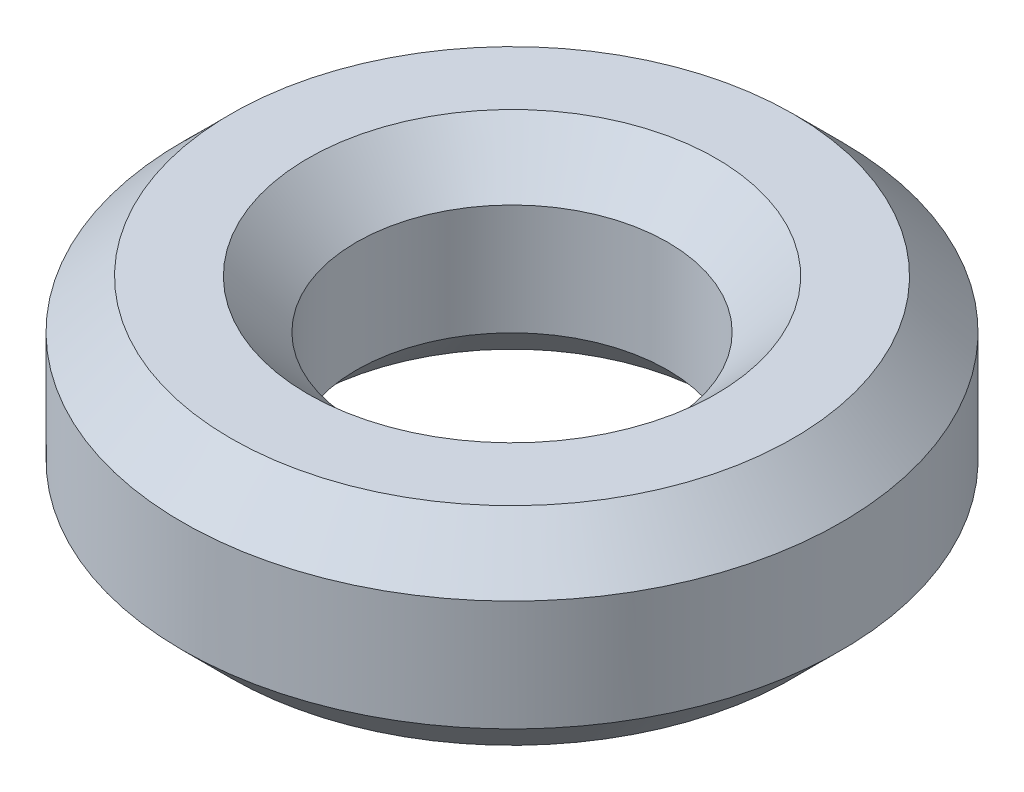
ISO-10303-21;
HEADER;
FILE_DESCRIPTION(('STEP AP214'),'2;1');
FILE_NAME('part.step','',(''),(''),'','','');
FILE_SCHEMA(('AUTOMOTIVE_DESIGN { 1 0 10303 214 1 1 1 1 }'));
ENDSEC;
DATA;
#1=APPLICATION_CONTEXT('core data for automotive mechanical design processes');
#2=APPLICATION_PROTOCOL_DEFINITION('international standard','automotive_design',2000,#1);
#3=PRODUCT_CONTEXT('',#1,'mechanical');
#4=PRODUCT('Part','Part','',(#3));
#5=PRODUCT_RELATED_PRODUCT_CATEGORY('part','',(#4));
#6=PRODUCT_DEFINITION_FORMATION('','',#4);
#7=PRODUCT_DEFINITION_CONTEXT('part definition',#1,'design');
#8=PRODUCT_DEFINITION('design','',#6,#7);
#9=PRODUCT_DEFINITION_SHAPE('','',#8);
#10=(LENGTH_UNIT() NAMED_UNIT(*) SI_UNIT(.MILLI.,.METRE.));
#11=(NAMED_UNIT(*) PLANE_ANGLE_UNIT() SI_UNIT($,.RADIAN.));
#12=(NAMED_UNIT(*) SI_UNIT($,.STERADIAN.) SOLID_ANGLE_UNIT());
#13=UNCERTAINTY_MEASURE_WITH_UNIT(LENGTH_MEASURE(1.E-05),#10,'distance_accuracy_value','');
#14=(GEOMETRIC_REPRESENTATION_CONTEXT(3) GLOBAL_UNCERTAINTY_ASSIGNED_CONTEXT((#13)) GLOBAL_UNIT_ASSIGNED_CONTEXT((#10,
#11,#12)) REPRESENTATION_CONTEXT('',''));
#15=CARTESIAN_POINT('',(0.,0.,0.));
#16=DIRECTION('',(0.,0.,1.));
#17=DIRECTION('',(1.,0.,0.));
#18=AXIS2_PLACEMENT_3D('',#15,#16,#17);
#19=CARTESIAN_POINT('',(0.,3.,0.));
#20=DIRECTION('',(0.,1.,0.));
#21=DIRECTION('',(0.,0.,1.));
#22=AXIS2_PLACEMENT_3D('',#19,#20,#21);
#23=PLANE('',#22);
#24=CARTESIAN_POINT('',(0.,3.,0.));
#25=DIRECTION('',(0.,1.,0.));
#26=DIRECTION('',(0.,0.,1.));
#27=AXIS2_PLACEMENT_3D('',#24,#25,#26);
#28=CIRCLE('',#27,2.95);
#29=CARTESIAN_POINT('',(0.,3.,2.95));
#30=VERTEX_POINT('',#29);
#31=EDGE_CURVE('E10',#30,#30,#28,.F.);
#32=ORIENTED_EDGE('',*,*,#31,.T.);
#33=EDGE_LOOP('',(#32));
#34=FACE_BOUND('',#33,.T.);
#35=CARTESIAN_POINT('',(0.,3.,0.));
#36=DIRECTION('',(0.,1.,0.));
#37=DIRECTION('',(0.,0.,1.));
#38=AXIS2_PLACEMENT_3D('',#35,#36,#37);
#39=CIRCLE('',#38,4.0625);
#40=CARTESIAN_POINT('',(0.,3.,-4.0625));
#41=VERTEX_POINT('',#40);
#42=EDGE_CURVE('E41',#41,#41,#39,.T.);
#43=ORIENTED_EDGE('',*,*,#42,.T.);
#44=EDGE_LOOP('',(#43));
#45=FACE_BOUND('',#44,.T.);
#46=ADVANCED_FACE('F33',(#34,#45),#23,.T.);
#47=CARTESIAN_POINT('',(0.,0.,0.));
#48=DIRECTION('',(0.,1.,0.));
#49=DIRECTION('',(0.,0.,1.));
#50=AXIS2_PLACEMENT_3D('',#47,#48,#49);
#51=PLANE('',#50);
#52=CARTESIAN_POINT('',(0.,0.,0.));
#53=DIRECTION('',(0.,1.,0.));
#54=DIRECTION('',(0.,0.,1.));
#55=AXIS2_PLACEMENT_3D('',#52,#53,#54);
#56=CIRCLE('',#55,2.95);
#57=CARTESIAN_POINT('',(0.,0.,2.95));
#58=VERTEX_POINT('',#57);
#59=EDGE_CURVE('E60',#58,#58,#56,.T.);
#60=ORIENTED_EDGE('',*,*,#59,.T.);
#61=EDGE_LOOP('',(#60));
#62=FACE_BOUND('',#61,.T.);
#63=CARTESIAN_POINT('',(0.,0.,0.));
#64=DIRECTION('',(0.,1.,0.));
#65=DIRECTION('',(0.,0.,1.));
#66=AXIS2_PLACEMENT_3D('',#63,#64,#65);
#67=CIRCLE('',#66,4.06249999999999);
#68=CARTESIAN_POINT('',(0.,0.,4.06249999999999));
#69=VERTEX_POINT('',#68);
#70=EDGE_CURVE('E63',#69,#69,#67,.F.);
#71=ORIENTED_EDGE('',*,*,#70,.T.);
#72=EDGE_LOOP('',(#71));
#73=FACE_BOUND('',#72,.T.);
#74=ADVANCED_FACE('F67',(#62,#73),#51,.F.);
#75=CARTESIAN_POINT('',(0.,3.,0.));
#76=DIRECTION('',(0.,-1.,0.));
#77=DIRECTION('',(0.,0.,-1.));
#78=AXIS2_PLACEMENT_3D('',#75,#76,#77);
#79=CYLINDRICAL_SURFACE('',#78,4.7625);
#80=CARTESIAN_POINT('',(0.,0.700000000000002,0.));
#81=DIRECTION('',(0.,1.,0.));
#82=DIRECTION('',(0.,0.,1.));
#83=AXIS2_PLACEMENT_3D('',#80,#81,#82);
#84=CIRCLE('',#83,4.7625);
#85=CARTESIAN_POINT('',(0.,0.700000000000002,4.7625));
#86=VERTEX_POINT('',#85);
#87=EDGE_CURVE('E45',#86,#86,#84,.T.);
#88=ORIENTED_EDGE('',*,*,#87,.T.);
#89=EDGE_LOOP('',(#88));
#90=FACE_BOUND('',#89,.T.);
#91=CARTESIAN_POINT('',(0.,2.3,0.));
#92=DIRECTION('',(0.,1.,0.));
#93=DIRECTION('',(0.,0.,1.));
#94=AXIS2_PLACEMENT_3D('',#91,#92,#93);
#95=CIRCLE('',#94,4.7625);
#96=CARTESIAN_POINT('',(0.,2.3,-4.7625));
#97=VERTEX_POINT('',#96);
#98=EDGE_CURVE('E49',#97,#97,#95,.F.);
#99=ORIENTED_EDGE('',*,*,#98,.T.);
#100=EDGE_LOOP('',(#99));
#101=FACE_BOUND('',#100,.T.);
#102=ADVANCED_FACE('F77',(#90,#101),#79,.T.);
#103=CARTESIAN_POINT('',(0.,3.,0.));
#104=DIRECTION('',(0.,-1.,0.));
#105=DIRECTION('',(0.,0.,-1.));
#106=AXIS2_PLACEMENT_3D('',#103,#104,#105);
#107=CYLINDRICAL_SURFACE('',#106,2.25);
#108=CARTESIAN_POINT('',(0.,0.700000000000003,0.));
#109=DIRECTION('',(0.,1.,0.));
#110=DIRECTION('',(0.,0.,1.));
#111=AXIS2_PLACEMENT_3D('',#108,#109,#110);
#112=CIRCLE('',#111,2.25);
#113=CARTESIAN_POINT('',(0.,0.700000000000003,2.25));
#114=VERTEX_POINT('',#113);
#115=EDGE_CURVE('E54',#114,#114,#112,.F.);
#116=ORIENTED_EDGE('',*,*,#115,.T.);
#117=EDGE_LOOP('',(#116));
#118=FACE_BOUND('',#117,.T.);
#119=CARTESIAN_POINT('',(0.,2.3,0.));
#120=DIRECTION('',(0.,1.,0.));
#121=DIRECTION('',(0.,0.,1.));
#122=AXIS2_PLACEMENT_3D('',#119,#120,#121);
#123=CIRCLE('',#122,2.25);
#124=CARTESIAN_POINT('',(0.,2.3,2.25));
#125=VERTEX_POINT('',#124);
#126=EDGE_CURVE('E57',#125,#125,#123,.T.);
#127=ORIENTED_EDGE('',*,*,#126,.T.);
#128=EDGE_LOOP('',(#127));
#129=FACE_BOUND('',#128,.T.);
#130=ADVANCED_FACE('F80',(#118,#129),#107,.F.);
#131=CARTESIAN_POINT('',(0.,0.,0.));
#132=DIRECTION('',(0.,-1.,0.));
#133=DIRECTION('',(0.,0.,-1.));
#134=AXIS2_PLACEMENT_3D('',#131,#132,#133);
#135=CONICAL_SURFACE('',#134,2.95,0.785398163397447);
#136=ORIENTED_EDGE('',*,*,#115,.F.);
#137=EDGE_LOOP('',(#136));
#138=FACE_BOUND('',#137,.T.);
#139=ORIENTED_EDGE('',*,*,#59,.F.);
#140=EDGE_LOOP('',(#139));
#141=FACE_BOUND('',#140,.T.);
#142=ADVANCED_FACE('F73',(#138,#141),#135,.F.);
#143=CARTESIAN_POINT('',(0.,0.700000000000002,0.));
#144=DIRECTION('',(0.,1.,0.));
#145=DIRECTION('',(0.,0.,1.));
#146=AXIS2_PLACEMENT_3D('',#143,#144,#145);
#147=CONICAL_SURFACE('',#146,4.7625,0.785398163397451);
#148=ORIENTED_EDGE('',*,*,#70,.F.);
#149=EDGE_LOOP('',(#148));
#150=FACE_BOUND('',#149,.T.);
#151=ORIENTED_EDGE('',*,*,#87,.F.);
#152=EDGE_LOOP('',(#151));
#153=FACE_BOUND('',#152,.T.);
#154=ADVANCED_FACE('F69',(#150,#153),#147,.T.);
#155=CARTESIAN_POINT('',(0.,2.3,0.));
#156=DIRECTION('',(0.,1.,0.));
#157=DIRECTION('',(0.,0.,1.));
#158=AXIS2_PLACEMENT_3D('',#155,#156,#157);
#159=CONICAL_SURFACE('',#158,2.25,0.78539816339745);
#160=ORIENTED_EDGE('',*,*,#31,.F.);
#161=EDGE_LOOP('',(#160));
#162=FACE_BOUND('',#161,.T.);
#163=ORIENTED_EDGE('',*,*,#126,.F.);
#164=EDGE_LOOP('',(#163));
#165=FACE_BOUND('',#164,.T.);
#166=ADVANCED_FACE('F72',(#162,#165),#159,.F.);
#167=CARTESIAN_POINT('',(0.,3.,0.));
#168=DIRECTION('',(0.,-1.,0.));
#169=DIRECTION('',(0.,0.,-1.));
#170=AXIS2_PLACEMENT_3D('',#167,#168,#169);
#171=CONICAL_SURFACE('',#170,4.0625,0.785398163397448);
#172=CARTESIAN_POINT('',(0.,2.3,-4.7625));
#173=CARTESIAN_POINT('',(0.,2.30729166666667,-4.75520833333333));
#174=CARTESIAN_POINT('',(0.,2.31458333333333,-4.74791666666667));
#175=CARTESIAN_POINT('',(0.,2.32916666666667,-4.73333333333333));
#176=CARTESIAN_POINT('',(0.,2.33645833333333,-4.72604166666667));
#177=CARTESIAN_POINT('',(0.,2.35104166666667,-4.71145833333333));
#178=CARTESIAN_POINT('',(0.,2.35833333333333,-4.70416666666667));
#179=CARTESIAN_POINT('',(0.,2.37291666666667,-4.68958333333333));
#180=CARTESIAN_POINT('',(0.,2.38020833333333,-4.68229166666667));
#181=CARTESIAN_POINT('',(0.,2.39479166666667,-4.66770833333333));
#182=CARTESIAN_POINT('',(0.,2.40208333333333,-4.66041666666667));
#183=CARTESIAN_POINT('',(0.,2.41666666666667,-4.64583333333333));
#184=CARTESIAN_POINT('',(0.,2.42395833333333,-4.63854166666667));
#185=CARTESIAN_POINT('',(0.,2.43854166666667,-4.62395833333333));
#186=CARTESIAN_POINT('',(0.,2.44583333333333,-4.61666666666667));
#187=CARTESIAN_POINT('',(0.,2.46041666666667,-4.60208333333333));
#188=CARTESIAN_POINT('',(0.,2.46770833333333,-4.59479166666667));
#189=CARTESIAN_POINT('',(0.,2.48229166666667,-4.58020833333333));
#190=CARTESIAN_POINT('',(0.,2.48958333333333,-4.57291666666667));
#191=CARTESIAN_POINT('',(0.,2.50416666666667,-4.55833333333333));
#192=CARTESIAN_POINT('',(0.,2.51145833333333,-4.55104166666667));
#193=CARTESIAN_POINT('',(0.,2.52604166666667,-4.53645833333333));
#194=CARTESIAN_POINT('',(0.,2.53333333333333,-4.52916666666667));
#195=CARTESIAN_POINT('',(0.,2.54791666666667,-4.51458333333334));
#196=CARTESIAN_POINT('',(0.,2.55520833333333,-4.50729166666667));
#197=CARTESIAN_POINT('',(0.,2.56979166666667,-4.49270833333333));
#198=CARTESIAN_POINT('',(0.,2.57708333333333,-4.48541666666667));
#199=CARTESIAN_POINT('',(0.,2.59166666666667,-4.47083333333333));
#200=CARTESIAN_POINT('',(0.,2.59895833333333,-4.46354166666667));
#201=CARTESIAN_POINT('',(0.,2.61354166666667,-4.44895833333333));
#202=CARTESIAN_POINT('',(0.,2.62083333333333,-4.44166666666667));
#203=CARTESIAN_POINT('',(0.,2.63541666666667,-4.42708333333333));
#204=CARTESIAN_POINT('',(0.,2.64270833333333,-4.41979166666667));
#205=CARTESIAN_POINT('',(0.,2.65729166666667,-4.40520833333334));
#206=CARTESIAN_POINT('',(0.,2.66458333333333,-4.39791666666667));
#207=CARTESIAN_POINT('',(0.,2.67916666666667,-4.38333333333333));
#208=CARTESIAN_POINT('',(0.,2.68645833333333,-4.37604166666667));
#209=CARTESIAN_POINT('',(0.,2.70104166666667,-4.36145833333333));
#210=CARTESIAN_POINT('',(0.,2.70833333333333,-4.35416666666667));
#211=CARTESIAN_POINT('',(0.,2.72291666666667,-4.33958333333334));
#212=CARTESIAN_POINT('',(0.,2.73020833333333,-4.33229166666667));
#213=CARTESIAN_POINT('',(0.,2.74479166666667,-4.31770833333333));
#214=CARTESIAN_POINT('',(0.,2.75208333333333,-4.31041666666667));
#215=CARTESIAN_POINT('',(0.,2.76666666666667,-4.29583333333333));
#216=CARTESIAN_POINT('',(0.,2.77395833333333,-4.28854166666667));
#217=CARTESIAN_POINT('',(0.,2.78854166666667,-4.27395833333334));
#218=CARTESIAN_POINT('',(0.,2.79583333333333,-4.26666666666667));
#219=CARTESIAN_POINT('',(0.,2.81041666666667,-4.25208333333333));
#220=CARTESIAN_POINT('',(0.,2.81770833333333,-4.24479166666667));
#221=CARTESIAN_POINT('',(0.,2.83229166666667,-4.23020833333334));
#222=CARTESIAN_POINT('',(0.,2.83958333333333,-4.22291666666667));
#223=CARTESIAN_POINT('',(0.,2.85416666666667,-4.20833333333333));
#224=CARTESIAN_POINT('',(0.,2.86145833333333,-4.20104166666667));
#225=CARTESIAN_POINT('',(0.,2.87604166666667,-4.18645833333334));
#226=CARTESIAN_POINT('',(0.,2.88333333333333,-4.17916666666667));
#227=CARTESIAN_POINT('',(0.,2.89791666666667,-4.16458333333334));
#228=CARTESIAN_POINT('',(0.,2.90520833333333,-4.15729166666667));
#229=CARTESIAN_POINT('',(0.,2.91979166666667,-4.14270833333333));
#230=CARTESIAN_POINT('',(0.,2.92708333333333,-4.13541666666667));
#231=CARTESIAN_POINT('',(0.,2.94166666666667,-4.12083333333333));
#232=CARTESIAN_POINT('',(0.,2.94895833333333,-4.11354166666667));
#233=CARTESIAN_POINT('',(0.,2.96354166666667,-4.09895833333334));
#234=CARTESIAN_POINT('',(0.,2.97083333333333,-4.09166666666667));
#235=CARTESIAN_POINT('',(0.,2.98541666666667,-4.07708333333334));
#236=CARTESIAN_POINT('',(0.,2.99270833333333,-4.06979166666667));
#237=CARTESIAN_POINT('',(0.,3.,-4.0625));
#238=B_SPLINE_CURVE_WITH_KNOTS('',3,(#172,#173,#174,#175,#176,#177,#178,#179,#180,#181,#182,
#183,#184,#185,#186,#187,#188,#189,#190,#191,#192,#193,#194,#195,#196,#197,#198,#199,#200,#201,
#202,#203,#204,#205,#206,#207,#208,#209,#210,#211,#212,#213,#214,#215,#216,#217,#218,#219,#220,
#221,#222,#223,#224,#225,#226,#227,#228,#229,#230,#231,#232,#233,#234,#235,#236,#237),
.UNSPECIFIED.,.F.,.F.,(4,2,2,2,2,2,2,2,2,2,2,2,2,2,2,2,2,2,2,2,2,2,2,2,2,2,2,2,2,2,2,2,4),(0.,
0.0309359216769117,0.0618718433538232,0.0928077650307343,0.123743686707646,0.154679608384557,
0.185615530061469,0.216551451738381,0.247487373415291,0.278423295092203,0.309359216769115,
0.340295138446026,0.371231060122937,0.402166981799849,0.43310290347676,0.464038825153671,
0.494974746830583,0.525910668507494,0.556846590184406,0.587782511861317,0.618718433538228,
0.64965435521514,0.680590276892051,0.711526198568963,0.742462120245874,0.773398041922786,
0.804333963599697,0.835269885276608,0.86620580695352,0.897141728630431,0.928077650307342,
0.959013571984254,0.989949493661165),.UNSPECIFIED.);
#239=EDGE_CURVE('BSEAM36',#97,#41,#238,.T.);
#240=ORIENTED_EDGE('',*,*,#98,.F.);
#241=ORIENTED_EDGE('',*,*,#42,.F.);
#242=ORIENTED_EDGE('',*,*,#239,.T.);
#243=ORIENTED_EDGE('',*,*,#239,.F.);
#244=EDGE_LOOP('',(#240,#242,#241,#243));
#245=FACE_BOUND('',#244,.T.);
#246=ADVANCED_FACE('F36',(#245),#171,.T.);
#247=CLOSED_SHELL('',(#46,#74,#102,#130,#142,#154,#166,#246));
#248=MANIFOLD_SOLID_BREP('B2',#247);
#249=ADVANCED_BREP_SHAPE_REPRESENTATION('',(#18,#248),#14);
#250=SHAPE_DEFINITION_REPRESENTATION(#9,#249);
ENDSEC;
END-ISO-10303-21;
